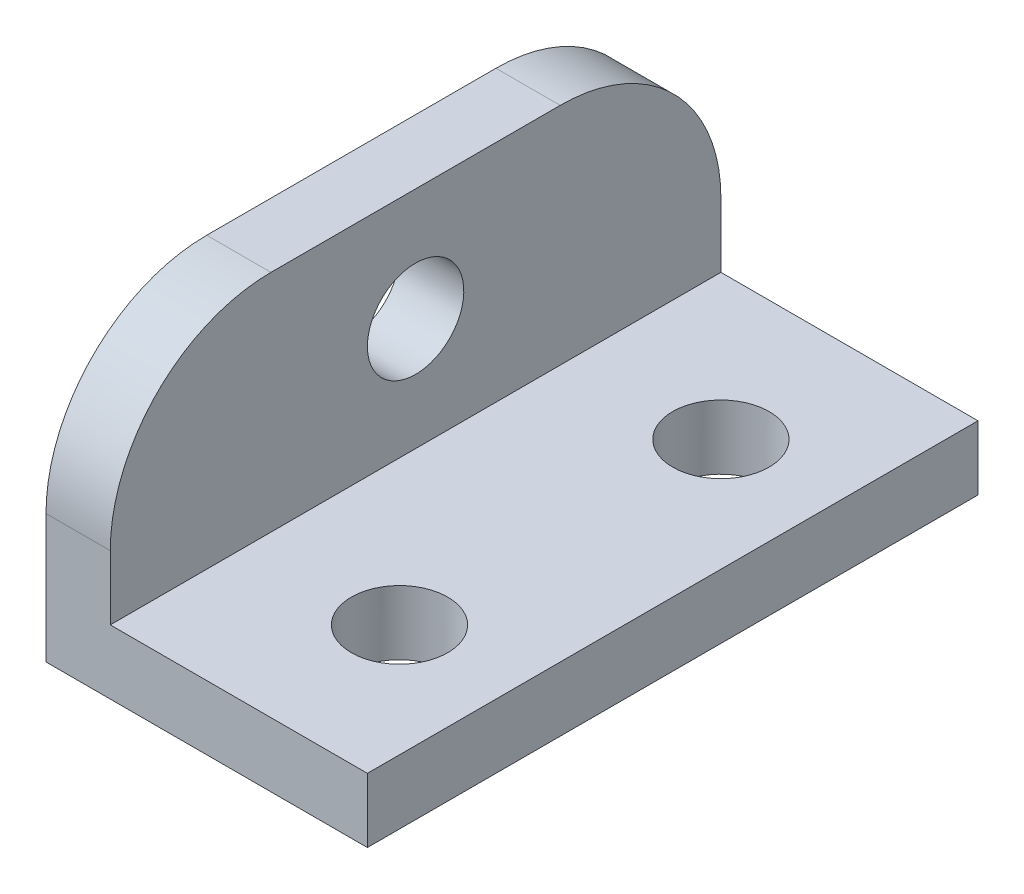
ISO-10303-21;
HEADER;
FILE_DESCRIPTION(('STEP AP214'),'2;1');
FILE_NAME('part.step','',(''),(''),'','','');
FILE_SCHEMA(('AUTOMOTIVE_DESIGN { 1 0 10303 214 1 1 1 1 }'));
ENDSEC;
DATA;
#1=APPLICATION_CONTEXT('core data for automotive mechanical design processes');
#2=APPLICATION_PROTOCOL_DEFINITION('international standard','automotive_design',2000,#1);
#3=PRODUCT_CONTEXT('',#1,'mechanical');
#4=PRODUCT('Part','Part','',(#3));
#5=PRODUCT_RELATED_PRODUCT_CATEGORY('part','',(#4));
#6=PRODUCT_DEFINITION_FORMATION('','',#4);
#7=PRODUCT_DEFINITION_CONTEXT('part definition',#1,'design');
#8=PRODUCT_DEFINITION('design','',#6,#7);
#9=PRODUCT_DEFINITION_SHAPE('','',#8);
#10=(LENGTH_UNIT() NAMED_UNIT(*) SI_UNIT(.MILLI.,.METRE.));
#11=(NAMED_UNIT(*) PLANE_ANGLE_UNIT() SI_UNIT($,.RADIAN.));
#12=(NAMED_UNIT(*) SI_UNIT($,.STERADIAN.) SOLID_ANGLE_UNIT());
#13=UNCERTAINTY_MEASURE_WITH_UNIT(LENGTH_MEASURE(1.E-05),#10,'distance_accuracy_value','');
#14=(GEOMETRIC_REPRESENTATION_CONTEXT(3) GLOBAL_UNCERTAINTY_ASSIGNED_CONTEXT((#13)) GLOBAL_UNIT_ASSIGNED_CONTEXT((#10,
#11,#12)) REPRESENTATION_CONTEXT('',''));
#15=CARTESIAN_POINT('',(0.,0.,0.));
#16=DIRECTION('',(0.,0.,1.));
#17=DIRECTION('',(1.,0.,0.));
#18=AXIS2_PLACEMENT_3D('',#15,#16,#17);
#19=CARTESIAN_POINT('',(10.,0.,9.5));
#20=DIRECTION('',(0.,1.,0.));
#21=DIRECTION('',(-1.,0.,0.));
#22=AXIS2_PLACEMENT_3D('',#19,#20,#21);
#23=PLANE('',#22);
#24=CARTESIAN_POINT('',(6.5,0.,5.));
#25=DIRECTION('',(0.,1.,0.));
#26=DIRECTION('',(-1.,0.,0.));
#27=AXIS2_PLACEMENT_3D('',#24,#25,#26);
#28=CIRCLE('',#27,1.5);
#29=CARTESIAN_POINT('',(5.,0.,5.));
#30=VERTEX_POINT('',#29);
#31=EDGE_CURVE('E189',#30,#30,#28,.T.);
#32=ORIENTED_EDGE('',*,*,#31,.T.);
#33=EDGE_LOOP('',(#32));
#34=FACE_BOUND('',#33,.T.);
#35=CARTESIAN_POINT('',(6.5,0.,-5.));
#36=DIRECTION('',(0.,1.,0.));
#37=DIRECTION('',(-1.,0.,0.));
#38=AXIS2_PLACEMENT_3D('',#35,#36,#37);
#39=CIRCLE('',#38,1.5);
#40=CARTESIAN_POINT('',(5.,0.,-5.));
#41=VERTEX_POINT('',#40);
#42=EDGE_CURVE('E181',#41,#41,#39,.T.);
#43=ORIENTED_EDGE('',*,*,#42,.T.);
#44=EDGE_LOOP('',(#43));
#45=FACE_BOUND('',#44,.T.);
#46=DIRECTION('',(1.,0.,0.));
#47=VECTOR('',#46,1.);
#48=CARTESIAN_POINT('',(10.,0.,-9.5));
#49=LINE('',#48,#47);
#50=CARTESIAN_POINT('',(0.,0.,-9.5));
#51=VERTEX_POINT('',#50);
#52=CARTESIAN_POINT('',(10.,0.,-9.5));
#53=VERTEX_POINT('',#52);
#54=EDGE_CURVE('E123',#51,#53,#49,.T.);
#55=ORIENTED_EDGE('',*,*,#54,.T.);
#56=DIRECTION('',(0.,0.,-1.));
#57=VECTOR('',#56,1.);
#58=CARTESIAN_POINT('',(10.,0.,9.5));
#59=LINE('',#58,#57);
#60=CARTESIAN_POINT('',(10.,0.,9.5));
#61=VERTEX_POINT('',#60);
#62=EDGE_CURVE('E102',#61,#53,#59,.T.);
#63=ORIENTED_EDGE('',*,*,#62,.F.);
#64=DIRECTION('',(1.,0.,0.));
#65=VECTOR('',#64,1.);
#66=CARTESIAN_POINT('',(10.,0.,9.5));
#67=LINE('',#66,#65);
#68=CARTESIAN_POINT('',(0.,0.,9.5));
#69=VERTEX_POINT('',#68);
#70=EDGE_CURVE('E109',#69,#61,#67,.T.);
#71=ORIENTED_EDGE('',*,*,#70,.F.);
#72=DIRECTION('',(0.,0.,-1.));
#73=VECTOR('',#72,1.);
#74=CARTESIAN_POINT('',(0.,0.,9.5));
#75=LINE('',#74,#73);
#76=EDGE_CURVE('E165',#69,#51,#75,.T.);
#77=ORIENTED_EDGE('',*,*,#76,.T.);
#78=EDGE_LOOP('',(#55,#63,#71,#77));
#79=FACE_BOUND('',#78,.T.);
#80=ADVANCED_FACE('F32',(#34,#45,#79),#23,.F.);
#81=CARTESIAN_POINT('',(10.,2.,9.5));
#82=DIRECTION('',(-1.,0.,0.));
#83=DIRECTION('',(0.,0.,1.));
#84=AXIS2_PLACEMENT_3D('',#81,#82,#83);
#85=PLANE('',#84);
#86=DIRECTION('',(0.,1.,0.));
#87=VECTOR('',#86,1.);
#88=CARTESIAN_POINT('',(10.,2.,-9.5));
#89=LINE('',#88,#87);
#90=CARTESIAN_POINT('',(10.,2.,-9.5));
#91=VERTEX_POINT('',#90);
#92=EDGE_CURVE('E176',#53,#91,#89,.T.);
#93=ORIENTED_EDGE('',*,*,#92,.T.);
#94=DIRECTION('',(0.,0.,-1.));
#95=VECTOR('',#94,1.);
#96=CARTESIAN_POINT('',(10.,2.,9.5));
#97=LINE('',#96,#95);
#98=CARTESIAN_POINT('',(10.,2.,9.5));
#99=VERTEX_POINT('',#98);
#100=EDGE_CURVE('E105',#99,#91,#97,.T.);
#101=ORIENTED_EDGE('',*,*,#100,.F.);
#102=DIRECTION('',(0.,1.,0.));
#103=VECTOR('',#102,1.);
#104=CARTESIAN_POINT('',(10.,2.,9.5));
#105=LINE('',#104,#103);
#106=EDGE_CURVE('E98',#61,#99,#105,.T.);
#107=ORIENTED_EDGE('',*,*,#106,.F.);
#108=ORIENTED_EDGE('',*,*,#62,.T.);
#109=EDGE_LOOP('',(#93,#101,#107,#108));
#110=FACE_BOUND('',#109,.T.);
#111=ADVANCED_FACE('F100',(#110),#85,.F.);
#112=CARTESIAN_POINT('',(2.,2.,9.5));
#113=DIRECTION('',(0.,-1.,0.));
#114=DIRECTION('',(0.,0.,-1.));
#115=AXIS2_PLACEMENT_3D('',#112,#113,#114);
#116=PLANE('',#115);
#117=CARTESIAN_POINT('',(6.5,2.,5.));
#118=DIRECTION('',(0.,1.,0.));
#119=DIRECTION('',(0.,0.,1.));
#120=AXIS2_PLACEMENT_3D('',#117,#118,#119);
#121=CIRCLE('',#120,1.5);
#122=CARTESIAN_POINT('',(6.5,2.,6.5));
#123=VERTEX_POINT('',#122);
#124=EDGE_CURVE('E134',#123,#123,#121,.T.);
#125=ORIENTED_EDGE('',*,*,#124,.F.);
#126=EDGE_LOOP('',(#125));
#127=FACE_BOUND('',#126,.T.);
#128=CARTESIAN_POINT('',(6.5,2.,-5.));
#129=DIRECTION('',(0.,1.,0.));
#130=DIRECTION('',(0.,0.,1.));
#131=AXIS2_PLACEMENT_3D('',#128,#129,#130);
#132=CIRCLE('',#131,1.5);
#133=CARTESIAN_POINT('',(6.5,2.,-3.5));
#134=VERTEX_POINT('',#133);
#135=EDGE_CURVE('E186',#134,#134,#132,.T.);
#136=ORIENTED_EDGE('',*,*,#135,.F.);
#137=EDGE_LOOP('',(#136));
#138=FACE_BOUND('',#137,.T.);
#139=DIRECTION('',(-1.,0.,0.));
#140=VECTOR('',#139,1.);
#141=CARTESIAN_POINT('',(2.,2.,-9.5));
#142=LINE('',#141,#140);
#143=CARTESIAN_POINT('',(2.,2.,-9.5));
#144=VERTEX_POINT('',#143);
#145=EDGE_CURVE('E174',#91,#144,#142,.T.);
#146=ORIENTED_EDGE('',*,*,#145,.T.);
#147=DIRECTION('',(0.,0.,-1.));
#148=VECTOR('',#147,1.);
#149=CARTESIAN_POINT('',(2.,2.,9.5));
#150=LINE('',#149,#148);
#151=CARTESIAN_POINT('',(2.,2.,9.5));
#152=VERTEX_POINT('',#151);
#153=EDGE_CURVE('E128',#152,#144,#150,.T.);
#154=ORIENTED_EDGE('',*,*,#153,.F.);
#155=DIRECTION('',(-1.,0.,0.));
#156=VECTOR('',#155,1.);
#157=CARTESIAN_POINT('',(2.,2.,9.5));
#158=LINE('',#157,#156);
#159=EDGE_CURVE('E108',#99,#152,#158,.T.);
#160=ORIENTED_EDGE('',*,*,#159,.F.);
#161=ORIENTED_EDGE('',*,*,#100,.T.);
#162=EDGE_LOOP('',(#146,#154,#160,#161));
#163=FACE_BOUND('',#162,.T.);
#164=ADVANCED_FACE('F201',(#127,#138,#163),#116,.F.);
#165=CARTESIAN_POINT('',(2.,9.,9.5));
#166=DIRECTION('',(-1.,0.,0.));
#167=DIRECTION('',(0.,-1.,0.));
#168=AXIS2_PLACEMENT_3D('',#165,#166,#167);
#169=PLANE('',#168);
#170=CARTESIAN_POINT('',(2.,5.5,0.));
#171=DIRECTION('',(1.,0.,0.));
#172=DIRECTION('',(0.,1.,0.));
#173=AXIS2_PLACEMENT_3D('',#170,#171,#172);
#174=CIRCLE('',#173,1.5);
#175=CARTESIAN_POINT('',(2.,7.,0.));
#176=VERTEX_POINT('',#175);
#177=EDGE_CURVE('E135',#176,#176,#174,.T.);
#178=ORIENTED_EDGE('',*,*,#177,.F.);
#179=EDGE_LOOP('',(#178));
#180=FACE_BOUND('',#179,.T.);
#181=DIRECTION('',(0.,0.,-1.));
#182=VECTOR('',#181,1.);
#183=CARTESIAN_POINT('',(2.,9.,9.5));
#184=LINE('',#183,#182);
#185=CARTESIAN_POINT('',(2.,9.,4.5));
#186=VERTEX_POINT('',#185);
#187=CARTESIAN_POINT('',(2.,9.,-4.5));
#188=VERTEX_POINT('',#187);
#189=EDGE_CURVE('E150',#186,#188,#184,.T.);
#190=ORIENTED_EDGE('',*,*,#189,.F.);
#191=CARTESIAN_POINT('',(2.,4.,4.5));
#192=DIRECTION('',(-1.,0.,0.));
#193=DIRECTION('',(0.,-1.,0.));
#194=AXIS2_PLACEMENT_3D('',#191,#192,#193);
#195=CIRCLE('',#194,5.);
#196=CARTESIAN_POINT('',(2.,4.,9.5));
#197=VERTEX_POINT('',#196);
#198=EDGE_CURVE('E40',#186,#197,#195,.F.);
#199=ORIENTED_EDGE('',*,*,#198,.T.);
#200=DIRECTION('',(0.,1.,0.));
#201=VECTOR('',#200,1.);
#202=CARTESIAN_POINT('',(2.,9.,9.5));
#203=LINE('',#202,#201);
#204=EDGE_CURVE('E149',#152,#197,#203,.T.);
#205=ORIENTED_EDGE('',*,*,#204,.F.);
#206=ORIENTED_EDGE('',*,*,#153,.T.);
#207=DIRECTION('',(0.,1.,0.));
#208=VECTOR('',#207,1.);
#209=CARTESIAN_POINT('',(2.,9.,-9.5));
#210=LINE('',#209,#208);
#211=CARTESIAN_POINT('',(2.,4.,-9.5));
#212=VERTEX_POINT('',#211);
#213=EDGE_CURVE('E170',#144,#212,#210,.T.);
#214=ORIENTED_EDGE('',*,*,#213,.T.);
#215=CARTESIAN_POINT('',(2.,4.,-4.5));
#216=DIRECTION('',(-1.,0.,0.));
#217=DIRECTION('',(0.,-1.,0.));
#218=AXIS2_PLACEMENT_3D('',#215,#216,#217);
#219=CIRCLE('',#218,5.);
#220=EDGE_CURVE('E52',#212,#188,#219,.F.);
#221=ORIENTED_EDGE('',*,*,#220,.T.);
#222=EDGE_LOOP('',(#190,#199,#205,#206,#214,#221));
#223=FACE_BOUND('',#222,.T.);
#224=ADVANCED_FACE('F147',(#180,#223),#169,.F.);
#225=CARTESIAN_POINT('',(0.,9.,9.5));
#226=DIRECTION('',(0.,-1.,0.));
#227=DIRECTION('',(0.,0.,-1.));
#228=AXIS2_PLACEMENT_3D('',#225,#226,#227);
#229=PLANE('',#228);
#230=DIRECTION('',(0.,0.,-1.));
#231=VECTOR('',#230,1.);
#232=CARTESIAN_POINT('',(0.,9.,9.5));
#233=LINE('',#232,#231);
#234=CARTESIAN_POINT('',(0.,9.,4.5));
#235=VERTEX_POINT('',#234);
#236=CARTESIAN_POINT('',(0.,9.,-4.5));
#237=VERTEX_POINT('',#236);
#238=EDGE_CURVE('E161',#235,#237,#233,.T.);
#239=ORIENTED_EDGE('',*,*,#238,.F.);
#240=DIRECTION('',(-1.,0.,0.));
#241=VECTOR('',#240,1.);
#242=CARTESIAN_POINT('',(0.,9.,4.5));
#243=LINE('',#242,#241);
#244=EDGE_CURVE('E143',#235,#186,#243,.F.);
#245=ORIENTED_EDGE('',*,*,#244,.T.);
#246=ORIENTED_EDGE('',*,*,#189,.T.);
#247=DIRECTION('',(-1.,0.,0.));
#248=VECTOR('',#247,1.);
#249=CARTESIAN_POINT('',(0.,9.,-4.5));
#250=LINE('',#249,#248);
#251=EDGE_CURVE('E140',#188,#237,#250,.T.);
#252=ORIENTED_EDGE('',*,*,#251,.T.);
#253=EDGE_LOOP('',(#239,#245,#246,#252));
#254=FACE_BOUND('',#253,.T.);
#255=ADVANCED_FACE('F163',(#254),#229,.F.);
#256=CARTESIAN_POINT('',(0.,0.,9.5));
#257=DIRECTION('',(1.,0.,0.));
#258=DIRECTION('',(0.,0.,-1.));
#259=AXIS2_PLACEMENT_3D('',#256,#257,#258);
#260=PLANE('',#259);
#261=CARTESIAN_POINT('',(0.,5.5,0.));
#262=DIRECTION('',(1.,0.,0.));
#263=DIRECTION('',(0.,0.,-1.));
#264=AXIS2_PLACEMENT_3D('',#261,#262,#263);
#265=CIRCLE('',#264,1.5);
#266=CARTESIAN_POINT('',(0.,5.5,-1.5));
#267=VERTEX_POINT('',#266);
#268=EDGE_CURVE('E132',#267,#267,#265,.T.);
#269=ORIENTED_EDGE('',*,*,#268,.T.);
#270=EDGE_LOOP('',(#269));
#271=FACE_BOUND('',#270,.T.);
#272=DIRECTION('',(0.,-1.,0.));
#273=VECTOR('',#272,1.);
#274=CARTESIAN_POINT('',(0.,0.,9.5));
#275=LINE('',#274,#273);
#276=CARTESIAN_POINT('',(0.,4.,9.5));
#277=VERTEX_POINT('',#276);
#278=EDGE_CURVE('E116',#277,#69,#275,.T.);
#279=ORIENTED_EDGE('',*,*,#278,.F.);
#280=CARTESIAN_POINT('',(0.,4.,4.5));
#281=DIRECTION('',(1.,0.,0.));
#282=DIRECTION('',(0.,0.,-1.));
#283=AXIS2_PLACEMENT_3D('',#280,#281,#282);
#284=CIRCLE('',#283,5.);
#285=EDGE_CURVE('E138',#277,#235,#284,.F.);
#286=ORIENTED_EDGE('',*,*,#285,.T.);
#287=ORIENTED_EDGE('',*,*,#238,.T.);
#288=CARTESIAN_POINT('',(0.,4.,-4.5));
#289=DIRECTION('',(1.,0.,0.));
#290=DIRECTION('',(0.,0.,-1.));
#291=AXIS2_PLACEMENT_3D('',#288,#289,#290);
#292=CIRCLE('',#291,5.);
#293=CARTESIAN_POINT('',(0.,4.,-9.5));
#294=VERTEX_POINT('',#293);
#295=EDGE_CURVE('E126',#237,#294,#292,.F.);
#296=ORIENTED_EDGE('',*,*,#295,.T.);
#297=DIRECTION('',(0.,-1.,0.));
#298=VECTOR('',#297,1.);
#299=CARTESIAN_POINT('',(0.,0.,-9.5));
#300=LINE('',#299,#298);
#301=EDGE_CURVE('E120',#294,#51,#300,.T.);
#302=ORIENTED_EDGE('',*,*,#301,.T.);
#303=ORIENTED_EDGE('',*,*,#76,.F.);
#304=EDGE_LOOP('',(#279,#286,#287,#296,#302,#303));
#305=FACE_BOUND('',#304,.T.);
#306=ADVANCED_FACE('F160',(#271,#305),#260,.F.);
#307=CARTESIAN_POINT('',(0.,0.,9.5));
#308=DIRECTION('',(0.,0.,-1.));
#309=DIRECTION('',(-1.,0.,0.));
#310=AXIS2_PLACEMENT_3D('',#307,#308,#309);
#311=PLANE('',#310);
#312=ORIENTED_EDGE('',*,*,#204,.T.);
#313=DIRECTION('',(-1.,0.,0.));
#314=VECTOR('',#313,1.);
#315=CARTESIAN_POINT('',(0.,4.,9.5));
#316=LINE('',#315,#314);
#317=EDGE_CURVE('E124',#197,#277,#316,.T.);
#318=ORIENTED_EDGE('',*,*,#317,.T.);
#319=ORIENTED_EDGE('',*,*,#278,.T.);
#320=ORIENTED_EDGE('',*,*,#70,.T.);
#321=ORIENTED_EDGE('',*,*,#106,.T.);
#322=ORIENTED_EDGE('',*,*,#159,.T.);
#323=EDGE_LOOP('',(#312,#318,#319,#320,#321,#322));
#324=FACE_BOUND('',#323,.T.);
#325=ADVANCED_FACE('F113',(#324),#311,.F.);
#326=CARTESIAN_POINT('',(0.,0.,-9.5));
#327=DIRECTION('',(0.,0.,-1.));
#328=DIRECTION('',(-1.,0.,0.));
#329=AXIS2_PLACEMENT_3D('',#326,#327,#328);
#330=PLANE('',#329);
#331=ORIENTED_EDGE('',*,*,#301,.F.);
#332=DIRECTION('',(-1.,0.,0.));
#333=VECTOR('',#332,1.);
#334=CARTESIAN_POINT('',(2.,4.,-9.5));
#335=LINE('',#334,#333);
#336=EDGE_CURVE('E11',#294,#212,#335,.F.);
#337=ORIENTED_EDGE('',*,*,#336,.T.);
#338=ORIENTED_EDGE('',*,*,#213,.F.);
#339=ORIENTED_EDGE('',*,*,#145,.F.);
#340=ORIENTED_EDGE('',*,*,#92,.F.);
#341=ORIENTED_EDGE('',*,*,#54,.F.);
#342=EDGE_LOOP('',(#331,#337,#338,#339,#340,#341));
#343=FACE_BOUND('',#342,.T.);
#344=ADVANCED_FACE('F173',(#343),#330,.T.);
#345=CARTESIAN_POINT('',(6.5,-17.,-5.));
#346=DIRECTION('',(0.,1.,0.));
#347=DIRECTION('',(0.,0.,1.));
#348=AXIS2_PLACEMENT_3D('',#345,#346,#347);
#349=CYLINDRICAL_SURFACE('',#348,1.5);
#350=ORIENTED_EDGE('',*,*,#135,.T.);
#351=EDGE_LOOP('',(#350));
#352=FACE_BOUND('',#351,.T.);
#353=ORIENTED_EDGE('',*,*,#42,.F.);
#354=EDGE_LOOP('',(#353));
#355=FACE_BOUND('',#354,.T.);
#356=ADVANCED_FACE('F229',(#352,#355),#349,.F.);
#357=CARTESIAN_POINT('',(6.5,-17.,5.));
#358=DIRECTION('',(0.,1.,0.));
#359=DIRECTION('',(0.,0.,1.));
#360=AXIS2_PLACEMENT_3D('',#357,#358,#359);
#361=CYLINDRICAL_SURFACE('',#360,1.5);
#362=ORIENTED_EDGE('',*,*,#124,.T.);
#363=EDGE_LOOP('',(#362));
#364=FACE_BOUND('',#363,.T.);
#365=ORIENTED_EDGE('',*,*,#31,.F.);
#366=EDGE_LOOP('',(#365));
#367=FACE_BOUND('',#366,.T.);
#368=ADVANCED_FACE('F224',(#364,#367),#361,.F.);
#369=CARTESIAN_POINT('',(-17.,5.5,0.));
#370=DIRECTION('',(1.,0.,0.));
#371=DIRECTION('',(0.,1.,0.));
#372=AXIS2_PLACEMENT_3D('',#369,#370,#371);
#373=CYLINDRICAL_SURFACE('',#372,1.5);
#374=ORIENTED_EDGE('',*,*,#177,.T.);
#375=EDGE_LOOP('',(#374));
#376=FACE_BOUND('',#375,.T.);
#377=ORIENTED_EDGE('',*,*,#268,.F.);
#378=EDGE_LOOP('',(#377));
#379=FACE_BOUND('',#378,.T.);
#380=ADVANCED_FACE('F197',(#376,#379),#373,.F.);
#381=CARTESIAN_POINT('',(0.,4.,4.5));
#382=DIRECTION('',(-1.,0.,0.));
#383=DIRECTION('',(0.,0.,1.));
#384=AXIS2_PLACEMENT_3D('',#381,#382,#383);
#385=CYLINDRICAL_SURFACE('',#384,5.);
#386=ORIENTED_EDGE('',*,*,#198,.F.);
#387=ORIENTED_EDGE('',*,*,#244,.F.);
#388=ORIENTED_EDGE('',*,*,#285,.F.);
#389=ORIENTED_EDGE('',*,*,#317,.F.);
#390=EDGE_LOOP('',(#386,#387,#388,#389));
#391=FACE_BOUND('',#390,.T.);
#392=ADVANCED_FACE('F156',(#391),#385,.T.);
#393=CARTESIAN_POINT('',(0.,4.,-4.5));
#394=DIRECTION('',(1.,0.,0.));
#395=DIRECTION('',(0.,0.,-1.));
#396=AXIS2_PLACEMENT_3D('',#393,#394,#395);
#397=CYLINDRICAL_SURFACE('',#396,5.);
#398=ORIENTED_EDGE('',*,*,#220,.F.);
#399=ORIENTED_EDGE('',*,*,#336,.F.);
#400=ORIENTED_EDGE('',*,*,#295,.F.);
#401=ORIENTED_EDGE('',*,*,#251,.F.);
#402=EDGE_LOOP('',(#398,#399,#400,#401));
#403=FACE_BOUND('',#402,.T.);
#404=ADVANCED_FACE('F34',(#403),#397,.T.);
#405=CLOSED_SHELL('',(#80,#111,#164,#224,#255,#306,#325,#344,#356,#368,#380,#392,#404));
#406=MANIFOLD_SOLID_BREP('B2',#405);
#407=ADVANCED_BREP_SHAPE_REPRESENTATION('',(#18,#406),#14);
#408=SHAPE_DEFINITION_REPRESENTATION(#9,#407);
ENDSEC;
END-ISO-10303-21;
